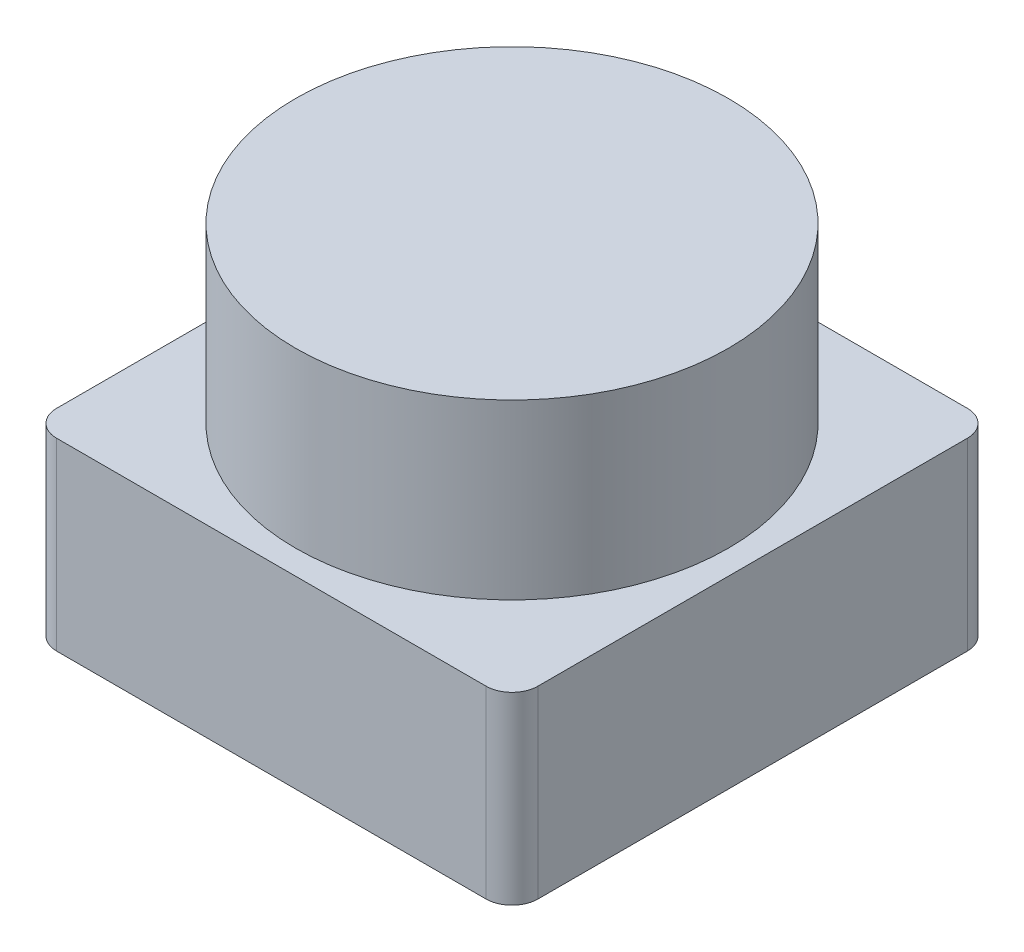
ISO-10303-21;
HEADER;
FILE_DESCRIPTION(('STEP AP214'),'2;1');
FILE_NAME('part.step','',(''),(''),'','','');
FILE_SCHEMA(('AUTOMOTIVE_DESIGN { 1 0 10303 214 1 1 1 1 }'));
ENDSEC;
DATA;
#1=APPLICATION_CONTEXT('core data for automotive mechanical design processes');
#2=APPLICATION_PROTOCOL_DEFINITION('international standard','automotive_design',2000,#1);
#3=PRODUCT_CONTEXT('',#1,'mechanical');
#4=PRODUCT('Part','Part','',(#3));
#5=PRODUCT_RELATED_PRODUCT_CATEGORY('part','',(#4));
#6=PRODUCT_DEFINITION_FORMATION('','',#4);
#7=PRODUCT_DEFINITION_CONTEXT('part definition',#1,'design');
#8=PRODUCT_DEFINITION('design','',#6,#7);
#9=PRODUCT_DEFINITION_SHAPE('','',#8);
#10=(LENGTH_UNIT() NAMED_UNIT(*) SI_UNIT(.MILLI.,.METRE.));
#11=(NAMED_UNIT(*) PLANE_ANGLE_UNIT() SI_UNIT($,.RADIAN.));
#12=(NAMED_UNIT(*) SI_UNIT($,.STERADIAN.) SOLID_ANGLE_UNIT());
#13=UNCERTAINTY_MEASURE_WITH_UNIT(LENGTH_MEASURE(1.E-05),#10,'distance_accuracy_value','');
#14=(GEOMETRIC_REPRESENTATION_CONTEXT(3) GLOBAL_UNCERTAINTY_ASSIGNED_CONTEXT((#13)) GLOBAL_UNIT_ASSIGNED_CONTEXT((#10,
#11,#12)) REPRESENTATION_CONTEXT('',''));
#15=CARTESIAN_POINT('',(0.,0.,0.));
#16=DIRECTION('',(0.,0.,1.));
#17=DIRECTION('',(1.,0.,0.));
#18=AXIS2_PLACEMENT_3D('',#15,#16,#17);
#19=CARTESIAN_POINT('',(0.,21.3,0.));
#20=DIRECTION('',(1.,0.,0.));
#21=DIRECTION('',(0.,0.,-1.));
#22=AXIS2_PLACEMENT_3D('',#19,#20,#21);
#23=PLANE('',#22);
#24=DIRECTION('',(0.,0.,1.));
#25=VECTOR('',#24,1.);
#26=CARTESIAN_POINT('',(0.,21.3,0.));
#27=LINE('',#26,#25);
#28=CARTESIAN_POINT('',(0.,21.3,-52.6));
#29=VERTEX_POINT('',#28);
#30=CARTESIAN_POINT('',(0.,21.3,-3.));
#31=VERTEX_POINT('',#30);
#32=EDGE_CURVE('E126',#29,#31,#27,.T.);
#33=ORIENTED_EDGE('',*,*,#32,.F.);
#34=DIRECTION('',(0.,-1.,0.));
#35=VECTOR('',#34,1.);
#36=CARTESIAN_POINT('',(0.,21.3,-52.6));
#37=LINE('',#36,#35);
#38=CARTESIAN_POINT('',(0.,0.,-52.6));
#39=VERTEX_POINT('',#38);
#40=EDGE_CURVE('E111',#29,#39,#37,.T.);
#41=ORIENTED_EDGE('',*,*,#40,.T.);
#42=DIRECTION('',(0.,0.,1.));
#43=VECTOR('',#42,1.);
#44=CARTESIAN_POINT('',(0.,0.,0.));
#45=LINE('',#44,#43);
#46=CARTESIAN_POINT('',(0.,0.,-3.));
#47=VERTEX_POINT('',#46);
#48=EDGE_CURVE('E123',#39,#47,#45,.T.);
#49=ORIENTED_EDGE('',*,*,#48,.T.);
#50=DIRECTION('',(0.,-1.,0.));
#51=VECTOR('',#50,1.);
#52=CARTESIAN_POINT('',(0.,21.3,-3.));
#53=LINE('',#52,#51);
#54=EDGE_CURVE('E128',#47,#31,#53,.F.);
#55=ORIENTED_EDGE('',*,*,#54,.T.);
#56=EDGE_LOOP('',(#33,#41,#49,#55));
#57=FACE_BOUND('',#56,.T.);
#58=ADVANCED_FACE('F41',(#57),#23,.F.);
#59=CARTESIAN_POINT('',(0.,21.3,0.));
#60=DIRECTION('',(0.,0.,-1.));
#61=DIRECTION('',(-1.,0.,0.));
#62=AXIS2_PLACEMENT_3D('',#59,#60,#61);
#63=PLANE('',#62);
#64=DIRECTION('',(1.,0.,0.));
#65=VECTOR('',#64,1.);
#66=CARTESIAN_POINT('',(0.,0.,0.));
#67=LINE('',#66,#65);
#68=CARTESIAN_POINT('',(3.,0.,0.));
#69=VERTEX_POINT('',#68);
#70=CARTESIAN_POINT('',(52.6,0.,0.));
#71=VERTEX_POINT('',#70);
#72=EDGE_CURVE('E132',#69,#71,#67,.T.);
#73=ORIENTED_EDGE('',*,*,#72,.T.);
#74=DIRECTION('',(0.,-1.,0.));
#75=VECTOR('',#74,1.);
#76=CARTESIAN_POINT('',(52.6,21.3,0.));
#77=LINE('',#76,#75);
#78=CARTESIAN_POINT('',(52.6,21.3,0.));
#79=VERTEX_POINT('',#78);
#80=EDGE_CURVE('E11',#71,#79,#77,.F.);
#81=ORIENTED_EDGE('',*,*,#80,.T.);
#82=DIRECTION('',(1.,0.,0.));
#83=VECTOR('',#82,1.);
#84=CARTESIAN_POINT('',(0.,21.3,0.));
#85=LINE('',#84,#83);
#86=CARTESIAN_POINT('',(3.,21.3,0.));
#87=VERTEX_POINT('',#86);
#88=EDGE_CURVE('E173',#87,#79,#85,.T.);
#89=ORIENTED_EDGE('',*,*,#88,.F.);
#90=DIRECTION('',(0.,-1.,0.));
#91=VECTOR('',#90,1.);
#92=CARTESIAN_POINT('',(3.,21.3,0.));
#93=LINE('',#92,#91);
#94=EDGE_CURVE('E49',#87,#69,#93,.T.);
#95=ORIENTED_EDGE('',*,*,#94,.T.);
#96=EDGE_LOOP('',(#73,#81,#89,#95));
#97=FACE_BOUND('',#96,.T.);
#98=ADVANCED_FACE('F171',(#97),#63,.F.);
#99=CARTESIAN_POINT('',(55.6,21.3,0.));
#100=DIRECTION('',(-1.,0.,0.));
#101=DIRECTION('',(0.,0.,1.));
#102=AXIS2_PLACEMENT_3D('',#99,#100,#101);
#103=PLANE('',#102);
#104=DIRECTION('',(0.,0.,-1.));
#105=VECTOR('',#104,1.);
#106=CARTESIAN_POINT('',(55.6,0.,0.));
#107=LINE('',#106,#105);
#108=CARTESIAN_POINT('',(55.6,0.,-3.));
#109=VERTEX_POINT('',#108);
#110=CARTESIAN_POINT('',(55.6,0.,-52.6));
#111=VERTEX_POINT('',#110);
#112=EDGE_CURVE('E136',#109,#111,#107,.T.);
#113=ORIENTED_EDGE('',*,*,#112,.T.);
#114=DIRECTION('',(0.,-1.,0.));
#115=VECTOR('',#114,1.);
#116=CARTESIAN_POINT('',(55.6,21.3,-52.6));
#117=LINE('',#116,#115);
#118=CARTESIAN_POINT('',(55.6,21.3,-52.6));
#119=VERTEX_POINT('',#118);
#120=EDGE_CURVE('E56',#111,#119,#117,.F.);
#121=ORIENTED_EDGE('',*,*,#120,.T.);
#122=DIRECTION('',(0.,0.,-1.));
#123=VECTOR('',#122,1.);
#124=CARTESIAN_POINT('',(55.6,21.3,0.));
#125=LINE('',#124,#123);
#126=CARTESIAN_POINT('',(55.6,21.3,-3.));
#127=VERTEX_POINT('',#126);
#128=EDGE_CURVE('E181',#127,#119,#125,.T.);
#129=ORIENTED_EDGE('',*,*,#128,.F.);
#130=DIRECTION('',(0.,-1.,0.));
#131=VECTOR('',#130,1.);
#132=CARTESIAN_POINT('',(55.6,21.3,-3.));
#133=LINE('',#132,#131);
#134=EDGE_CURVE('E164',#127,#109,#133,.T.);
#135=ORIENTED_EDGE('',*,*,#134,.T.);
#136=EDGE_LOOP('',(#113,#121,#129,#135));
#137=FACE_BOUND('',#136,.T.);
#138=ADVANCED_FACE('F180',(#137),#103,.F.);
#139=CARTESIAN_POINT('',(0.,21.3,-55.6));
#140=DIRECTION('',(0.,0.,1.));
#141=DIRECTION('',(1.,0.,0.));
#142=AXIS2_PLACEMENT_3D('',#139,#140,#141);
#143=PLANE('',#142);
#144=DIRECTION('',(-1.,0.,0.));
#145=VECTOR('',#144,1.);
#146=CARTESIAN_POINT('',(0.,0.,-55.6));
#147=LINE('',#146,#145);
#148=CARTESIAN_POINT('',(52.6,0.,-55.6));
#149=VERTEX_POINT('',#148);
#150=CARTESIAN_POINT('',(3.,0.,-55.6));
#151=VERTEX_POINT('',#150);
#152=EDGE_CURVE('E146',#149,#151,#147,.T.);
#153=ORIENTED_EDGE('',*,*,#152,.T.);
#154=DIRECTION('',(0.,-1.,0.));
#155=VECTOR('',#154,1.);
#156=CARTESIAN_POINT('',(3.,21.3,-55.6));
#157=LINE('',#156,#155);
#158=CARTESIAN_POINT('',(3.,21.3,-55.6));
#159=VERTEX_POINT('',#158);
#160=EDGE_CURVE('E112',#151,#159,#157,.F.);
#161=ORIENTED_EDGE('',*,*,#160,.T.);
#162=DIRECTION('',(-1.,0.,0.));
#163=VECTOR('',#162,1.);
#164=CARTESIAN_POINT('',(0.,21.3,-55.6));
#165=LINE('',#164,#163);
#166=CARTESIAN_POINT('',(52.6,21.3,-55.6));
#167=VERTEX_POINT('',#166);
#168=EDGE_CURVE('E142',#167,#159,#165,.T.);
#169=ORIENTED_EDGE('',*,*,#168,.F.);
#170=DIRECTION('',(0.,-1.,0.));
#171=VECTOR('',#170,1.);
#172=CARTESIAN_POINT('',(52.6,21.3,-55.6));
#173=LINE('',#172,#171);
#174=EDGE_CURVE('E117',#167,#149,#173,.T.);
#175=ORIENTED_EDGE('',*,*,#174,.T.);
#176=EDGE_LOOP('',(#153,#161,#169,#175));
#177=FACE_BOUND('',#176,.T.);
#178=ADVANCED_FACE('F266',(#177),#143,.F.);
#179=CARTESIAN_POINT('',(0.,21.3,0.));
#180=DIRECTION('',(0.,-1.,0.));
#181=DIRECTION('',(0.,0.,-1.));
#182=AXIS2_PLACEMENT_3D('',#179,#180,#181);
#183=PLANE('',#182);
#184=CARTESIAN_POINT('',(27.8,21.3,-27.8));
#185=DIRECTION('',(0.,1.,0.));
#186=DIRECTION('',(0.,0.,1.));
#187=AXIS2_PLACEMENT_3D('',#184,#185,#186);
#188=CIRCLE('',#187,25.);
#189=CARTESIAN_POINT('',(27.8,21.3,-2.80000000000001));
#190=VERTEX_POINT('',#189);
#191=EDGE_CURVE('E148',#190,#190,#188,.T.);
#192=ORIENTED_EDGE('',*,*,#191,.F.);
#193=EDGE_LOOP('',(#192));
#194=FACE_BOUND('',#193,.T.);
#195=ORIENTED_EDGE('',*,*,#168,.T.);
#196=CARTESIAN_POINT('',(3.,21.3,-52.6));
#197=DIRECTION('',(0.,-1.,0.));
#198=DIRECTION('',(0.,0.,-1.));
#199=AXIS2_PLACEMENT_3D('',#196,#197,#198);
#200=CIRCLE('',#199,3.);
#201=EDGE_CURVE('E162',#159,#29,#200,.F.);
#202=ORIENTED_EDGE('',*,*,#201,.T.);
#203=ORIENTED_EDGE('',*,*,#32,.T.);
#204=CARTESIAN_POINT('',(3.,21.3,-3.));
#205=DIRECTION('',(0.,-1.,0.));
#206=DIRECTION('',(0.,0.,-1.));
#207=AXIS2_PLACEMENT_3D('',#204,#205,#206);
#208=CIRCLE('',#207,3.);
#209=EDGE_CURVE('E157',#31,#87,#208,.F.);
#210=ORIENTED_EDGE('',*,*,#209,.T.);
#211=ORIENTED_EDGE('',*,*,#88,.T.);
#212=CARTESIAN_POINT('',(52.6,21.3,-3.));
#213=DIRECTION('',(0.,-1.,0.));
#214=DIRECTION('',(0.,0.,-1.));
#215=AXIS2_PLACEMENT_3D('',#212,#213,#214);
#216=CIRCLE('',#215,3.);
#217=EDGE_CURVE('E63',#79,#127,#216,.F.);
#218=ORIENTED_EDGE('',*,*,#217,.T.);
#219=ORIENTED_EDGE('',*,*,#128,.T.);
#220=CARTESIAN_POINT('',(52.6,21.3,-52.6));
#221=DIRECTION('',(0.,-1.,0.));
#222=DIRECTION('',(0.,0.,-1.));
#223=AXIS2_PLACEMENT_3D('',#220,#221,#222);
#224=CIRCLE('',#223,3.);
#225=EDGE_CURVE('E160',#119,#167,#224,.F.);
#226=ORIENTED_EDGE('',*,*,#225,.T.);
#227=EDGE_LOOP('',(#195,#202,#203,#210,#211,#218,#219,#226));
#228=FACE_BOUND('',#227,.T.);
#229=ADVANCED_FACE('F218',(#194,#228),#183,.F.);
#230=CARTESIAN_POINT('',(0.,0.,0.));
#231=DIRECTION('',(0.,-1.,0.));
#232=DIRECTION('',(0.,0.,-1.));
#233=AXIS2_PLACEMENT_3D('',#230,#231,#232);
#234=PLANE('',#233);
#235=CARTESIAN_POINT('',(49.3,0.,-49.3));
#236=DIRECTION('',(0.,-1.,0.));
#237=DIRECTION('',(0.,0.,-1.));
#238=AXIS2_PLACEMENT_3D('',#235,#236,#237);
#239=CIRCLE('',#238,1.50000000000002);
#240=CARTESIAN_POINT('',(49.3,0.,-50.8));
#241=VERTEX_POINT('',#240);
#242=EDGE_CURVE('E209',#241,#241,#239,.T.);
#243=ORIENTED_EDGE('',*,*,#242,.F.);
#244=EDGE_LOOP('',(#243));
#245=FACE_BOUND('',#244,.T.);
#246=CARTESIAN_POINT('',(6.3,0.,-49.3));
#247=DIRECTION('',(0.,-1.,0.));
#248=DIRECTION('',(0.,0.,-1.));
#249=AXIS2_PLACEMENT_3D('',#246,#247,#248);
#250=CIRCLE('',#249,1.50000000000001);
#251=CARTESIAN_POINT('',(6.3,0.,-50.8));
#252=VERTEX_POINT('',#251);
#253=EDGE_CURVE('E203',#252,#252,#250,.T.);
#254=ORIENTED_EDGE('',*,*,#253,.F.);
#255=EDGE_LOOP('',(#254));
#256=FACE_BOUND('',#255,.T.);
#257=CARTESIAN_POINT('',(6.3,0.,-6.30000000000001));
#258=DIRECTION('',(0.,-1.,0.));
#259=DIRECTION('',(0.,0.,-1.));
#260=AXIS2_PLACEMENT_3D('',#257,#258,#259);
#261=CIRCLE('',#260,1.50000000000001);
#262=CARTESIAN_POINT('',(6.3,0.,-7.80000000000002));
#263=VERTEX_POINT('',#262);
#264=EDGE_CURVE('E197',#263,#263,#261,.T.);
#265=ORIENTED_EDGE('',*,*,#264,.F.);
#266=EDGE_LOOP('',(#265));
#267=FACE_BOUND('',#266,.T.);
#268=CARTESIAN_POINT('',(49.3,0.,-6.30000000000001));
#269=DIRECTION('',(0.,-1.,0.));
#270=DIRECTION('',(0.,0.,-1.));
#271=AXIS2_PLACEMENT_3D('',#268,#269,#270);
#272=CIRCLE('',#271,1.50000000000002);
#273=CARTESIAN_POINT('',(49.3,0.,-7.80000000000002));
#274=VERTEX_POINT('',#273);
#275=EDGE_CURVE('E191',#274,#274,#272,.T.);
#276=ORIENTED_EDGE('',*,*,#275,.F.);
#277=EDGE_LOOP('',(#276));
#278=FACE_BOUND('',#277,.T.);
#279=ORIENTED_EDGE('',*,*,#48,.F.);
#280=CARTESIAN_POINT('',(3.,0.,-52.6));
#281=DIRECTION('',(0.,-1.,0.));
#282=DIRECTION('',(0.,0.,-1.));
#283=AXIS2_PLACEMENT_3D('',#280,#281,#282);
#284=CIRCLE('',#283,3.);
#285=EDGE_CURVE('E107',#39,#151,#284,.T.);
#286=ORIENTED_EDGE('',*,*,#285,.T.);
#287=ORIENTED_EDGE('',*,*,#152,.F.);
#288=CARTESIAN_POINT('',(52.6,0.,-52.6));
#289=DIRECTION('',(0.,-1.,0.));
#290=DIRECTION('',(0.,0.,-1.));
#291=AXIS2_PLACEMENT_3D('',#288,#289,#290);
#292=CIRCLE('',#291,3.);
#293=EDGE_CURVE('E118',#149,#111,#292,.T.);
#294=ORIENTED_EDGE('',*,*,#293,.T.);
#295=ORIENTED_EDGE('',*,*,#112,.F.);
#296=CARTESIAN_POINT('',(52.6,0.,-3.));
#297=DIRECTION('',(0.,-1.,0.));
#298=DIRECTION('',(0.,0.,-1.));
#299=AXIS2_PLACEMENT_3D('',#296,#297,#298);
#300=CIRCLE('',#299,3.);
#301=EDGE_CURVE('E151',#109,#71,#300,.T.);
#302=ORIENTED_EDGE('',*,*,#301,.T.);
#303=ORIENTED_EDGE('',*,*,#72,.F.);
#304=CARTESIAN_POINT('',(3.,0.,-3.));
#305=DIRECTION('',(0.,-1.,0.));
#306=DIRECTION('',(0.,0.,-1.));
#307=AXIS2_PLACEMENT_3D('',#304,#305,#306);
#308=CIRCLE('',#307,3.);
#309=EDGE_CURVE('E127',#69,#47,#308,.T.);
#310=ORIENTED_EDGE('',*,*,#309,.T.);
#311=EDGE_LOOP('',(#279,#286,#287,#294,#295,#302,#303,#310));
#312=FACE_BOUND('',#311,.T.);
#313=ADVANCED_FACE('F130',(#245,#256,#267,#278,#312),#234,.T.);
#314=CARTESIAN_POINT('',(27.8,41.3,-27.8));
#315=DIRECTION('',(0.,-1.,0.));
#316=DIRECTION('',(0.,0.,-1.));
#317=AXIS2_PLACEMENT_3D('',#314,#315,#316);
#318=CYLINDRICAL_SURFACE('',#317,25.);
#319=CARTESIAN_POINT('',(27.8,41.3,-27.8));
#320=DIRECTION('',(0.,1.,0.));
#321=DIRECTION('',(0.,0.,1.));
#322=AXIS2_PLACEMENT_3D('',#319,#320,#321);
#323=CIRCLE('',#322,25.);
#324=CARTESIAN_POINT('',(27.8,41.3,-2.80000000000001));
#325=VERTEX_POINT('',#324);
#326=EDGE_CURVE('E133',#325,#325,#323,.T.);
#327=ORIENTED_EDGE('',*,*,#326,.F.);
#328=EDGE_LOOP('',(#327));
#329=FACE_BOUND('',#328,.T.);
#330=ORIENTED_EDGE('',*,*,#191,.T.);
#331=EDGE_LOOP('',(#330));
#332=FACE_BOUND('',#331,.T.);
#333=ADVANCED_FACE('F217',(#329,#332),#318,.T.);
#334=CARTESIAN_POINT('',(0.,41.3,0.));
#335=DIRECTION('',(0.,1.,0.));
#336=DIRECTION('',(0.,0.,1.));
#337=AXIS2_PLACEMENT_3D('',#334,#335,#336);
#338=PLANE('',#337);
#339=ORIENTED_EDGE('',*,*,#326,.T.);
#340=EDGE_LOOP('',(#339));
#341=FACE_BOUND('',#340,.T.);
#342=ADVANCED_FACE('F254',(#341),#338,.T.);
#343=CARTESIAN_POINT('',(3.,21.3,-52.6));
#344=DIRECTION('',(0.,-1.,0.));
#345=DIRECTION('',(0.,0.,-1.));
#346=AXIS2_PLACEMENT_3D('',#343,#344,#345);
#347=CYLINDRICAL_SURFACE('',#346,3.);
#348=ORIENTED_EDGE('',*,*,#201,.F.);
#349=ORIENTED_EDGE('',*,*,#160,.F.);
#350=ORIENTED_EDGE('',*,*,#285,.F.);
#351=ORIENTED_EDGE('',*,*,#40,.F.);
#352=EDGE_LOOP('',(#348,#349,#350,#351));
#353=FACE_BOUND('',#352,.T.);
#354=ADVANCED_FACE('F110',(#353),#347,.T.);
#355=CARTESIAN_POINT('',(52.6,21.3,-52.6));
#356=DIRECTION('',(0.,-1.,0.));
#357=DIRECTION('',(0.,0.,-1.));
#358=AXIS2_PLACEMENT_3D('',#355,#356,#357);
#359=CYLINDRICAL_SURFACE('',#358,3.);
#360=ORIENTED_EDGE('',*,*,#225,.F.);
#361=ORIENTED_EDGE('',*,*,#120,.F.);
#362=ORIENTED_EDGE('',*,*,#293,.F.);
#363=ORIENTED_EDGE('',*,*,#174,.F.);
#364=EDGE_LOOP('',(#360,#361,#362,#363));
#365=FACE_BOUND('',#364,.T.);
#366=ADVANCED_FACE('F253',(#365),#359,.T.);
#367=CARTESIAN_POINT('',(52.6,21.3,-3.));
#368=DIRECTION('',(0.,-1.,0.));
#369=DIRECTION('',(0.,0.,-1.));
#370=AXIS2_PLACEMENT_3D('',#367,#368,#369);
#371=CYLINDRICAL_SURFACE('',#370,3.);
#372=ORIENTED_EDGE('',*,*,#217,.F.);
#373=ORIENTED_EDGE('',*,*,#80,.F.);
#374=ORIENTED_EDGE('',*,*,#301,.F.);
#375=ORIENTED_EDGE('',*,*,#134,.F.);
#376=EDGE_LOOP('',(#372,#373,#374,#375));
#377=FACE_BOUND('',#376,.T.);
#378=ADVANCED_FACE('F179',(#377),#371,.T.);
#379=CARTESIAN_POINT('',(3.,21.3,-3.));
#380=DIRECTION('',(0.,-1.,0.));
#381=DIRECTION('',(0.,0.,-1.));
#382=AXIS2_PLACEMENT_3D('',#379,#380,#381);
#383=CYLINDRICAL_SURFACE('',#382,3.);
#384=ORIENTED_EDGE('',*,*,#209,.F.);
#385=ORIENTED_EDGE('',*,*,#54,.F.);
#386=ORIENTED_EDGE('',*,*,#309,.F.);
#387=ORIENTED_EDGE('',*,*,#94,.F.);
#388=EDGE_LOOP('',(#384,#385,#386,#387));
#389=FACE_BOUND('',#388,.T.);
#390=ADVANCED_FACE('F43',(#389),#383,.T.);
#391=CARTESIAN_POINT('',(49.3,4.,-6.30000000000001));
#392=DIRECTION('',(0.,1.,0.));
#393=DIRECTION('',(0.,0.,1.));
#394=AXIS2_PLACEMENT_3D('',#391,#392,#393);
#395=PLANE('',#394);
#396=CARTESIAN_POINT('',(49.3,4.,-6.30000000000001));
#397=DIRECTION('',(0.,-1.,0.));
#398=DIRECTION('',(0.,0.,-1.));
#399=AXIS2_PLACEMENT_3D('',#396,#397,#398);
#400=CIRCLE('',#399,1.50000000000002);
#401=CARTESIAN_POINT('',(49.3,4.,-7.80000000000002));
#402=VERTEX_POINT('',#401);
#403=EDGE_CURVE('E139',#402,#402,#400,.T.);
#404=ORIENTED_EDGE('',*,*,#403,.T.);
#405=EDGE_LOOP('',(#404));
#406=FACE_BOUND('',#405,.T.);
#407=ADVANCED_FACE('F229',(#406),#395,.F.);
#408=CARTESIAN_POINT('',(49.3,0.,-6.30000000000001));
#409=DIRECTION('',(0.,-1.,0.));
#410=DIRECTION('',(0.,0.,-1.));
#411=AXIS2_PLACEMENT_3D('',#408,#409,#410);
#412=CYLINDRICAL_SURFACE('',#411,1.50000000000002);
#413=ORIENTED_EDGE('',*,*,#403,.F.);
#414=EDGE_LOOP('',(#413));
#415=FACE_BOUND('',#414,.T.);
#416=ORIENTED_EDGE('',*,*,#275,.T.);
#417=EDGE_LOOP('',(#416));
#418=FACE_BOUND('',#417,.T.);
#419=ADVANCED_FACE('F226',(#415,#418),#412,.F.);
#420=CARTESIAN_POINT('',(6.3,4.,-6.30000000000001));
#421=DIRECTION('',(0.,1.,0.));
#422=DIRECTION('',(0.,0.,1.));
#423=AXIS2_PLACEMENT_3D('',#420,#421,#422);
#424=PLANE('',#423);
#425=CARTESIAN_POINT('',(6.3,4.,-6.30000000000001));
#426=DIRECTION('',(0.,-1.,0.));
#427=DIRECTION('',(0.,0.,-1.));
#428=AXIS2_PLACEMENT_3D('',#425,#426,#427);
#429=CIRCLE('',#428,1.50000000000001);
#430=CARTESIAN_POINT('',(6.3,4.,-7.80000000000002));
#431=VERTEX_POINT('',#430);
#432=EDGE_CURVE('E194',#431,#431,#429,.T.);
#433=ORIENTED_EDGE('',*,*,#432,.T.);
#434=EDGE_LOOP('',(#433));
#435=FACE_BOUND('',#434,.T.);
#436=ADVANCED_FACE('F228',(#435),#424,.F.);
#437=CARTESIAN_POINT('',(6.3,0.,-6.30000000000001));
#438=DIRECTION('',(0.,-1.,0.));
#439=DIRECTION('',(0.,0.,-1.));
#440=AXIS2_PLACEMENT_3D('',#437,#438,#439);
#441=CYLINDRICAL_SURFACE('',#440,1.50000000000001);
#442=ORIENTED_EDGE('',*,*,#432,.F.);
#443=EDGE_LOOP('',(#442));
#444=FACE_BOUND('',#443,.T.);
#445=ORIENTED_EDGE('',*,*,#264,.T.);
#446=EDGE_LOOP('',(#445));
#447=FACE_BOUND('',#446,.T.);
#448=ADVANCED_FACE('F236',(#444,#447),#441,.F.);
#449=CARTESIAN_POINT('',(6.3,4.,-49.3));
#450=DIRECTION('',(0.,1.,0.));
#451=DIRECTION('',(0.,0.,1.));
#452=AXIS2_PLACEMENT_3D('',#449,#450,#451);
#453=PLANE('',#452);
#454=CARTESIAN_POINT('',(6.3,4.,-49.3));
#455=DIRECTION('',(0.,-1.,0.));
#456=DIRECTION('',(0.,0.,-1.));
#457=AXIS2_PLACEMENT_3D('',#454,#455,#456);
#458=CIRCLE('',#457,1.50000000000001);
#459=CARTESIAN_POINT('',(6.3,4.,-50.8));
#460=VERTEX_POINT('',#459);
#461=EDGE_CURVE('E200',#460,#460,#458,.T.);
#462=ORIENTED_EDGE('',*,*,#461,.T.);
#463=EDGE_LOOP('',(#462));
#464=FACE_BOUND('',#463,.T.);
#465=ADVANCED_FACE('F340',(#464),#453,.F.);
#466=CARTESIAN_POINT('',(6.3,0.,-49.3));
#467=DIRECTION('',(0.,-1.,0.));
#468=DIRECTION('',(0.,0.,-1.));
#469=AXIS2_PLACEMENT_3D('',#466,#467,#468);
#470=CYLINDRICAL_SURFACE('',#469,1.50000000000001);
#471=ORIENTED_EDGE('',*,*,#461,.F.);
#472=EDGE_LOOP('',(#471));
#473=FACE_BOUND('',#472,.T.);
#474=ORIENTED_EDGE('',*,*,#253,.T.);
#475=EDGE_LOOP('',(#474));
#476=FACE_BOUND('',#475,.T.);
#477=ADVANCED_FACE('F349',(#473,#476),#470,.F.);
#478=CARTESIAN_POINT('',(49.3,4.,-49.3));
#479=DIRECTION('',(0.,1.,0.));
#480=DIRECTION('',(0.,0.,1.));
#481=AXIS2_PLACEMENT_3D('',#478,#479,#480);
#482=PLANE('',#481);
#483=CARTESIAN_POINT('',(49.3,4.,-49.3));
#484=DIRECTION('',(0.,-1.,0.));
#485=DIRECTION('',(0.,0.,-1.));
#486=AXIS2_PLACEMENT_3D('',#483,#484,#485);
#487=CIRCLE('',#486,1.50000000000002);
#488=CARTESIAN_POINT('',(49.3,4.,-50.8));
#489=VERTEX_POINT('',#488);
#490=EDGE_CURVE('E206',#489,#489,#487,.T.);
#491=ORIENTED_EDGE('',*,*,#490,.T.);
#492=EDGE_LOOP('',(#491));
#493=FACE_BOUND('',#492,.T.);
#494=ADVANCED_FACE('F358',(#493),#482,.F.);
#495=CARTESIAN_POINT('',(49.3,0.,-49.3));
#496=DIRECTION('',(0.,-1.,0.));
#497=DIRECTION('',(0.,0.,-1.));
#498=AXIS2_PLACEMENT_3D('',#495,#496,#497);
#499=CYLINDRICAL_SURFACE('',#498,1.50000000000002);
#500=ORIENTED_EDGE('',*,*,#490,.F.);
#501=EDGE_LOOP('',(#500));
#502=FACE_BOUND('',#501,.T.);
#503=ORIENTED_EDGE('',*,*,#242,.T.);
#504=EDGE_LOOP('',(#503));
#505=FACE_BOUND('',#504,.T.);
#506=ADVANCED_FACE('F213',(#502,#505),#499,.F.);
#507=CLOSED_SHELL('',(#58,#98,#138,#178,#229,#313,#333,#342,#354,#366,#378,#390,#407,#419,#436,
#448,#465,#477,#494,#506));
#508=MANIFOLD_SOLID_BREP('B2',#507);
#509=ADVANCED_BREP_SHAPE_REPRESENTATION('',(#18,#508),#14);
#510=SHAPE_DEFINITION_REPRESENTATION(#9,#509);
ENDSEC;
END-ISO-10303-21;
